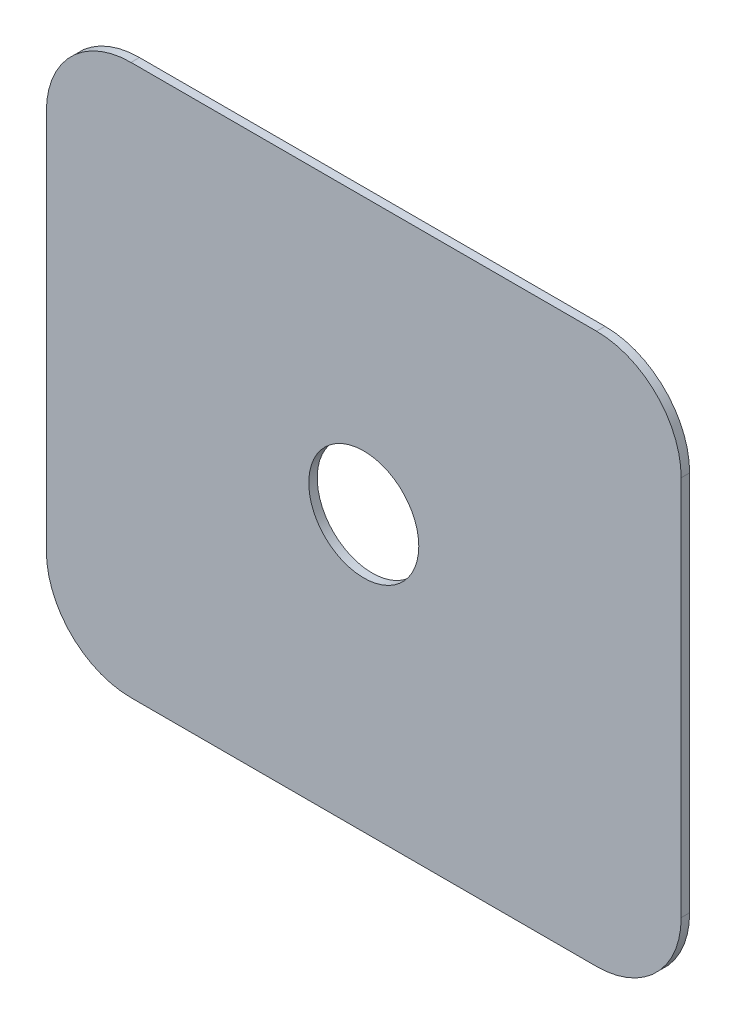
ISO-10303-21;
HEADER;
FILE_DESCRIPTION(('STEP AP214'),'2;1');
FILE_NAME('part.step','',(''),(''),'','','');
FILE_SCHEMA(('AUTOMOTIVE_DESIGN { 1 0 10303 214 1 1 1 1 }'));
ENDSEC;
DATA;
#1=APPLICATION_CONTEXT('core data for automotive mechanical design processes');
#2=APPLICATION_PROTOCOL_DEFINITION('international standard','automotive_design',2000,#1);
#3=PRODUCT_CONTEXT('',#1,'mechanical');
#4=PRODUCT('Part','Part','',(#3));
#5=PRODUCT_RELATED_PRODUCT_CATEGORY('part','',(#4));
#6=PRODUCT_DEFINITION_FORMATION('','',#4);
#7=PRODUCT_DEFINITION_CONTEXT('part definition',#1,'design');
#8=PRODUCT_DEFINITION('design','',#6,#7);
#9=PRODUCT_DEFINITION_SHAPE('','',#8);
#10=(LENGTH_UNIT() NAMED_UNIT(*) SI_UNIT(.MILLI.,.METRE.));
#11=(NAMED_UNIT(*) PLANE_ANGLE_UNIT() SI_UNIT($,.RADIAN.));
#12=(NAMED_UNIT(*) SI_UNIT($,.STERADIAN.) SOLID_ANGLE_UNIT());
#13=UNCERTAINTY_MEASURE_WITH_UNIT(LENGTH_MEASURE(1.E-05),#10,'distance_accuracy_value','');
#14=(GEOMETRIC_REPRESENTATION_CONTEXT(3) GLOBAL_UNCERTAINTY_ASSIGNED_CONTEXT((#13)) GLOBAL_UNIT_ASSIGNED_CONTEXT((#10,
#11,#12)) REPRESENTATION_CONTEXT('',''));
#15=CARTESIAN_POINT('',(0.,0.,0.));
#16=DIRECTION('',(0.,0.,1.));
#17=DIRECTION('',(1.,0.,0.));
#18=AXIS2_PLACEMENT_3D('',#15,#16,#17);
#19=CARTESIAN_POINT('',(0.,0.,2.));
#20=DIRECTION('',(0.,0.,1.));
#21=DIRECTION('',(1.,0.,0.));
#22=AXIS2_PLACEMENT_3D('',#19,#20,#21);
#23=PLANE('',#22);
#24=DIRECTION('',(1.,0.,0.));
#25=VECTOR('',#24,1.);
#26=CARTESIAN_POINT('',(-75.,-65.,2.));
#27=LINE('',#26,#25);
#28=CARTESIAN_POINT('',(-55.,-65.,2.));
#29=VERTEX_POINT('',#28);
#30=CARTESIAN_POINT('',(55.,-65.,2.));
#31=VERTEX_POINT('',#30);
#32=EDGE_CURVE('E143',#29,#31,#27,.T.);
#33=ORIENTED_EDGE('',*,*,#32,.T.);
#34=CARTESIAN_POINT('',(55.,-45.,2.));
#35=DIRECTION('',(0.,0.,1.));
#36=DIRECTION('',(1.,0.,0.));
#37=AXIS2_PLACEMENT_3D('',#34,#35,#36);
#38=CIRCLE('',#37,20.);
#39=CARTESIAN_POINT('',(75.,-45.,2.));
#40=VERTEX_POINT('',#39);
#41=EDGE_CURVE('E162',#31,#40,#38,.T.);
#42=ORIENTED_EDGE('',*,*,#41,.T.);
#43=DIRECTION('',(0.,1.,0.));
#44=VECTOR('',#43,1.);
#45=CARTESIAN_POINT('',(75.,65.,2.));
#46=LINE('',#45,#44);
#47=CARTESIAN_POINT('',(75.,45.,2.));
#48=VERTEX_POINT('',#47);
#49=EDGE_CURVE('E126',#40,#48,#46,.T.);
#50=ORIENTED_EDGE('',*,*,#49,.T.);
#51=CARTESIAN_POINT('',(55.,45.,2.));
#52=DIRECTION('',(0.,0.,1.));
#53=DIRECTION('',(1.,0.,0.));
#54=AXIS2_PLACEMENT_3D('',#51,#52,#53);
#55=CIRCLE('',#54,20.);
#56=CARTESIAN_POINT('',(55.,65.,2.));
#57=VERTEX_POINT('',#56);
#58=EDGE_CURVE('E160',#48,#57,#55,.T.);
#59=ORIENTED_EDGE('',*,*,#58,.T.);
#60=DIRECTION('',(-1.,0.,0.));
#61=VECTOR('',#60,1.);
#62=CARTESIAN_POINT('',(-75.,65.,2.));
#63=LINE('',#62,#61);
#64=CARTESIAN_POINT('',(-55.,65.,2.));
#65=VERTEX_POINT('',#64);
#66=EDGE_CURVE('E182',#57,#65,#63,.T.);
#67=ORIENTED_EDGE('',*,*,#66,.T.);
#68=CARTESIAN_POINT('',(-55.,45.,2.));
#69=DIRECTION('',(0.,0.,1.));
#70=DIRECTION('',(1.,0.,0.));
#71=AXIS2_PLACEMENT_3D('',#68,#69,#70);
#72=CIRCLE('',#71,20.);
#73=CARTESIAN_POINT('',(-75.,45.,2.));
#74=VERTEX_POINT('',#73);
#75=EDGE_CURVE('E61',#65,#74,#72,.T.);
#76=ORIENTED_EDGE('',*,*,#75,.T.);
#77=DIRECTION('',(0.,-1.,0.));
#78=VECTOR('',#77,1.);
#79=CARTESIAN_POINT('',(-75.,65.,2.));
#80=LINE('',#79,#78);
#81=CARTESIAN_POINT('',(-75.,-45.,2.));
#82=VERTEX_POINT('',#81);
#83=EDGE_CURVE('E172',#74,#82,#80,.T.);
#84=ORIENTED_EDGE('',*,*,#83,.T.);
#85=CARTESIAN_POINT('',(-55.,-45.,2.));
#86=DIRECTION('',(0.,0.,1.));
#87=DIRECTION('',(1.,0.,0.));
#88=AXIS2_PLACEMENT_3D('',#85,#86,#87);
#89=CIRCLE('',#88,20.);
#90=EDGE_CURVE('E158',#82,#29,#89,.T.);
#91=ORIENTED_EDGE('',*,*,#90,.T.);
#92=EDGE_LOOP('',(#33,#42,#50,#59,#67,#76,#84,#91));
#93=FACE_BOUND('',#92,.T.);
#94=CARTESIAN_POINT('',(0.,0.,2.));
#95=DIRECTION('',(0.,0.,1.));
#96=DIRECTION('',(1.,0.,0.));
#97=AXIS2_PLACEMENT_3D('',#94,#95,#96);
#98=CIRCLE('',#97,13.);
#99=CARTESIAN_POINT('',(13.,0.,2.));
#100=VERTEX_POINT('',#99);
#101=EDGE_CURVE('E134',#100,#100,#98,.T.);
#102=ORIENTED_EDGE('',*,*,#101,.F.);
#103=EDGE_LOOP('',(#102));
#104=FACE_BOUND('',#103,.T.);
#105=ADVANCED_FACE('F41',(#93,#104),#23,.T.);
#106=CARTESIAN_POINT('',(0.,0.,0.));
#107=DIRECTION('',(0.,0.,1.));
#108=DIRECTION('',(1.,0.,0.));
#109=AXIS2_PLACEMENT_3D('',#106,#107,#108);
#110=PLANE('',#109);
#111=DIRECTION('',(0.,1.,0.));
#112=VECTOR('',#111,1.);
#113=CARTESIAN_POINT('',(75.,65.,0.));
#114=LINE('',#113,#112);
#115=CARTESIAN_POINT('',(75.,-45.,0.));
#116=VERTEX_POINT('',#115);
#117=CARTESIAN_POINT('',(75.,45.,0.));
#118=VERTEX_POINT('',#117);
#119=EDGE_CURVE('E123',#116,#118,#114,.T.);
#120=ORIENTED_EDGE('',*,*,#119,.F.);
#121=CARTESIAN_POINT('',(55.,-45.,0.));
#122=DIRECTION('',(0.,0.,1.));
#123=DIRECTION('',(1.,0.,0.));
#124=AXIS2_PLACEMENT_3D('',#121,#122,#123);
#125=CIRCLE('',#124,20.);
#126=CARTESIAN_POINT('',(55.,-65.,0.));
#127=VERTEX_POINT('',#126);
#128=EDGE_CURVE('E106',#116,#127,#125,.F.);
#129=ORIENTED_EDGE('',*,*,#128,.T.);
#130=DIRECTION('',(1.,0.,0.));
#131=VECTOR('',#130,1.);
#132=CARTESIAN_POINT('',(-75.,-65.,0.));
#133=LINE('',#132,#131);
#134=CARTESIAN_POINT('',(-55.,-65.,0.));
#135=VERTEX_POINT('',#134);
#136=EDGE_CURVE('E147',#135,#127,#133,.T.);
#137=ORIENTED_EDGE('',*,*,#136,.F.);
#138=CARTESIAN_POINT('',(-55.,-45.,0.));
#139=DIRECTION('',(0.,0.,1.));
#140=DIRECTION('',(1.,0.,0.));
#141=AXIS2_PLACEMENT_3D('',#138,#139,#140);
#142=CIRCLE('',#141,20.);
#143=CARTESIAN_POINT('',(-75.,-45.,0.));
#144=VERTEX_POINT('',#143);
#145=EDGE_CURVE('E151',#135,#144,#142,.F.);
#146=ORIENTED_EDGE('',*,*,#145,.T.);
#147=DIRECTION('',(0.,-1.,0.));
#148=VECTOR('',#147,1.);
#149=CARTESIAN_POINT('',(-75.,65.,0.));
#150=LINE('',#149,#148);
#151=CARTESIAN_POINT('',(-75.,45.,0.));
#152=VERTEX_POINT('',#151);
#153=EDGE_CURVE('E137',#152,#144,#150,.T.);
#154=ORIENTED_EDGE('',*,*,#153,.F.);
#155=CARTESIAN_POINT('',(-55.,45.,0.));
#156=DIRECTION('',(0.,0.,1.));
#157=DIRECTION('',(1.,0.,0.));
#158=AXIS2_PLACEMENT_3D('',#155,#156,#157);
#159=CIRCLE('',#158,20.);
#160=CARTESIAN_POINT('',(-55.,65.,0.));
#161=VERTEX_POINT('',#160);
#162=EDGE_CURVE('E127',#152,#161,#159,.F.);
#163=ORIENTED_EDGE('',*,*,#162,.T.);
#164=DIRECTION('',(-1.,0.,0.));
#165=VECTOR('',#164,1.);
#166=CARTESIAN_POINT('',(-75.,65.,0.));
#167=LINE('',#166,#165);
#168=CARTESIAN_POINT('',(55.,65.,0.));
#169=VERTEX_POINT('',#168);
#170=EDGE_CURVE('E133',#169,#161,#167,.T.);
#171=ORIENTED_EDGE('',*,*,#170,.F.);
#172=CARTESIAN_POINT('',(55.,45.,0.));
#173=DIRECTION('',(0.,0.,1.));
#174=DIRECTION('',(1.,0.,0.));
#175=AXIS2_PLACEMENT_3D('',#172,#173,#174);
#176=CIRCLE('',#175,20.);
#177=EDGE_CURVE('E117',#169,#118,#176,.F.);
#178=ORIENTED_EDGE('',*,*,#177,.T.);
#179=EDGE_LOOP('',(#120,#129,#137,#146,#154,#163,#171,#178));
#180=FACE_BOUND('',#179,.T.);
#181=CARTESIAN_POINT('',(0.,0.,0.));
#182=DIRECTION('',(0.,0.,1.));
#183=DIRECTION('',(1.,0.,0.));
#184=AXIS2_PLACEMENT_3D('',#181,#182,#183);
#185=CIRCLE('',#184,13.);
#186=CARTESIAN_POINT('',(13.,0.,0.));
#187=VERTEX_POINT('',#186);
#188=EDGE_CURVE('E140',#187,#187,#185,.T.);
#189=ORIENTED_EDGE('',*,*,#188,.T.);
#190=EDGE_LOOP('',(#189));
#191=FACE_BOUND('',#190,.T.);
#192=ADVANCED_FACE('F130',(#180,#191),#110,.F.);
#193=CARTESIAN_POINT('',(75.,65.,2.));
#194=DIRECTION('',(-1.,0.,0.));
#195=DIRECTION('',(0.,-1.,0.));
#196=AXIS2_PLACEMENT_3D('',#193,#194,#195);
#197=PLANE('',#196);
#198=ORIENTED_EDGE('',*,*,#49,.F.);
#199=DIRECTION('',(0.,0.,-1.));
#200=VECTOR('',#199,1.);
#201=CARTESIAN_POINT('',(75.,-45.,2.));
#202=LINE('',#201,#200);
#203=EDGE_CURVE('E110',#40,#116,#202,.T.);
#204=ORIENTED_EDGE('',*,*,#203,.T.);
#205=ORIENTED_EDGE('',*,*,#119,.T.);
#206=DIRECTION('',(0.,0.,-1.));
#207=VECTOR('',#206,1.);
#208=CARTESIAN_POINT('',(75.,45.,2.));
#209=LINE('',#208,#207);
#210=EDGE_CURVE('E128',#118,#48,#209,.F.);
#211=ORIENTED_EDGE('',*,*,#210,.T.);
#212=EDGE_LOOP('',(#198,#204,#205,#211));
#213=FACE_BOUND('',#212,.T.);
#214=ADVANCED_FACE('F122',(#213),#197,.F.);
#215=CARTESIAN_POINT('',(-75.,65.,2.));
#216=DIRECTION('',(0.,-1.,0.));
#217=DIRECTION('',(0.,0.,-1.));
#218=AXIS2_PLACEMENT_3D('',#215,#216,#217);
#219=PLANE('',#218);
#220=ORIENTED_EDGE('',*,*,#66,.F.);
#221=DIRECTION('',(0.,0.,-1.));
#222=VECTOR('',#221,1.);
#223=CARTESIAN_POINT('',(55.,65.,2.));
#224=LINE('',#223,#222);
#225=EDGE_CURVE('E166',#57,#169,#224,.T.);
#226=ORIENTED_EDGE('',*,*,#225,.T.);
#227=ORIENTED_EDGE('',*,*,#170,.T.);
#228=DIRECTION('',(0.,0.,-1.));
#229=VECTOR('',#228,1.);
#230=CARTESIAN_POINT('',(-55.,65.,2.));
#231=LINE('',#230,#229);
#232=EDGE_CURVE('E164',#161,#65,#231,.F.);
#233=ORIENTED_EDGE('',*,*,#232,.T.);
#234=EDGE_LOOP('',(#220,#226,#227,#233));
#235=FACE_BOUND('',#234,.T.);
#236=ADVANCED_FACE('F210',(#235),#219,.F.);
#237=CARTESIAN_POINT('',(-75.,65.,2.));
#238=DIRECTION('',(1.,0.,0.));
#239=DIRECTION('',(0.,1.,0.));
#240=AXIS2_PLACEMENT_3D('',#237,#238,#239);
#241=PLANE('',#240);
#242=ORIENTED_EDGE('',*,*,#153,.T.);
#243=DIRECTION('',(0.,0.,-1.));
#244=VECTOR('',#243,1.);
#245=CARTESIAN_POINT('',(-75.,-45.,2.));
#246=LINE('',#245,#244);
#247=EDGE_CURVE('E11',#144,#82,#246,.F.);
#248=ORIENTED_EDGE('',*,*,#247,.T.);
#249=ORIENTED_EDGE('',*,*,#83,.F.);
#250=DIRECTION('',(0.,0.,-1.));
#251=VECTOR('',#250,1.);
#252=CARTESIAN_POINT('',(-75.,45.,2.));
#253=LINE('',#252,#251);
#254=EDGE_CURVE('E49',#74,#152,#253,.T.);
#255=ORIENTED_EDGE('',*,*,#254,.T.);
#256=EDGE_LOOP('',(#242,#248,#249,#255));
#257=FACE_BOUND('',#256,.T.);
#258=ADVANCED_FACE('F171',(#257),#241,.F.);
#259=CARTESIAN_POINT('',(-75.,-65.,2.));
#260=DIRECTION('',(0.,1.,0.));
#261=DIRECTION('',(0.,0.,1.));
#262=AXIS2_PLACEMENT_3D('',#259,#260,#261);
#263=PLANE('',#262);
#264=ORIENTED_EDGE('',*,*,#136,.T.);
#265=DIRECTION('',(0.,0.,-1.));
#266=VECTOR('',#265,1.);
#267=CARTESIAN_POINT('',(55.,-65.,2.));
#268=LINE('',#267,#266);
#269=EDGE_CURVE('E111',#127,#31,#268,.F.);
#270=ORIENTED_EDGE('',*,*,#269,.T.);
#271=ORIENTED_EDGE('',*,*,#32,.F.);
#272=DIRECTION('',(0.,0.,-1.));
#273=VECTOR('',#272,1.);
#274=CARTESIAN_POINT('',(-55.,-65.,2.));
#275=LINE('',#274,#273);
#276=EDGE_CURVE('E116',#29,#135,#275,.T.);
#277=ORIENTED_EDGE('',*,*,#276,.T.);
#278=EDGE_LOOP('',(#264,#270,#271,#277));
#279=FACE_BOUND('',#278,.T.);
#280=ADVANCED_FACE('F180',(#279),#263,.F.);
#281=CARTESIAN_POINT('',(0.,0.,2.));
#282=DIRECTION('',(0.,0.,-1.));
#283=DIRECTION('',(-1.,0.,0.));
#284=AXIS2_PLACEMENT_3D('',#281,#282,#283);
#285=CYLINDRICAL_SURFACE('',#284,13.);
#286=ORIENTED_EDGE('',*,*,#101,.T.);
#287=EDGE_LOOP('',(#286));
#288=FACE_BOUND('',#287,.T.);
#289=ORIENTED_EDGE('',*,*,#188,.F.);
#290=EDGE_LOOP('',(#289));
#291=FACE_BOUND('',#290,.T.);
#292=ADVANCED_FACE('F189',(#288,#291),#285,.F.);
#293=CARTESIAN_POINT('',(55.,-45.,2.));
#294=DIRECTION('',(0.,0.,-1.));
#295=DIRECTION('',(-1.,0.,0.));
#296=AXIS2_PLACEMENT_3D('',#293,#294,#295);
#297=CYLINDRICAL_SURFACE('',#296,20.);
#298=ORIENTED_EDGE('',*,*,#41,.F.);
#299=ORIENTED_EDGE('',*,*,#269,.F.);
#300=ORIENTED_EDGE('',*,*,#128,.F.);
#301=ORIENTED_EDGE('',*,*,#203,.F.);
#302=EDGE_LOOP('',(#298,#299,#300,#301));
#303=FACE_BOUND('',#302,.T.);
#304=ADVANCED_FACE('F109',(#303),#297,.T.);
#305=CARTESIAN_POINT('',(55.,45.,2.));
#306=DIRECTION('',(0.,0.,-1.));
#307=DIRECTION('',(-1.,0.,0.));
#308=AXIS2_PLACEMENT_3D('',#305,#306,#307);
#309=CYLINDRICAL_SURFACE('',#308,20.);
#310=ORIENTED_EDGE('',*,*,#58,.F.);
#311=ORIENTED_EDGE('',*,*,#210,.F.);
#312=ORIENTED_EDGE('',*,*,#177,.F.);
#313=ORIENTED_EDGE('',*,*,#225,.F.);
#314=EDGE_LOOP('',(#310,#311,#312,#313));
#315=FACE_BOUND('',#314,.T.);
#316=ADVANCED_FACE('F197',(#315),#309,.T.);
#317=CARTESIAN_POINT('',(-55.,-45.,2.));
#318=DIRECTION('',(0.,0.,-1.));
#319=DIRECTION('',(-1.,0.,0.));
#320=AXIS2_PLACEMENT_3D('',#317,#318,#319);
#321=CYLINDRICAL_SURFACE('',#320,20.);
#322=ORIENTED_EDGE('',*,*,#90,.F.);
#323=ORIENTED_EDGE('',*,*,#247,.F.);
#324=ORIENTED_EDGE('',*,*,#145,.F.);
#325=ORIENTED_EDGE('',*,*,#276,.F.);
#326=EDGE_LOOP('',(#322,#323,#324,#325));
#327=FACE_BOUND('',#326,.T.);
#328=ADVANCED_FACE('F177',(#327),#321,.T.);
#329=CARTESIAN_POINT('',(-55.,45.,2.));
#330=DIRECTION('',(0.,0.,-1.));
#331=DIRECTION('',(-1.,0.,0.));
#332=AXIS2_PLACEMENT_3D('',#329,#330,#331);
#333=CYLINDRICAL_SURFACE('',#332,20.);
#334=ORIENTED_EDGE('',*,*,#75,.F.);
#335=ORIENTED_EDGE('',*,*,#232,.F.);
#336=ORIENTED_EDGE('',*,*,#162,.F.);
#337=ORIENTED_EDGE('',*,*,#254,.F.);
#338=EDGE_LOOP('',(#334,#335,#336,#337));
#339=FACE_BOUND('',#338,.T.);
#340=ADVANCED_FACE('F43',(#339),#333,.T.);
#341=CLOSED_SHELL('',(#105,#192,#214,#236,#258,#280,#292,#304,#316,#328,#340));
#342=MANIFOLD_SOLID_BREP('B2',#341);
#343=ADVANCED_BREP_SHAPE_REPRESENTATION('',(#18,#342),#14);
#344=SHAPE_DEFINITION_REPRESENTATION(#9,#343);
ENDSEC;
END-ISO-10303-21;
